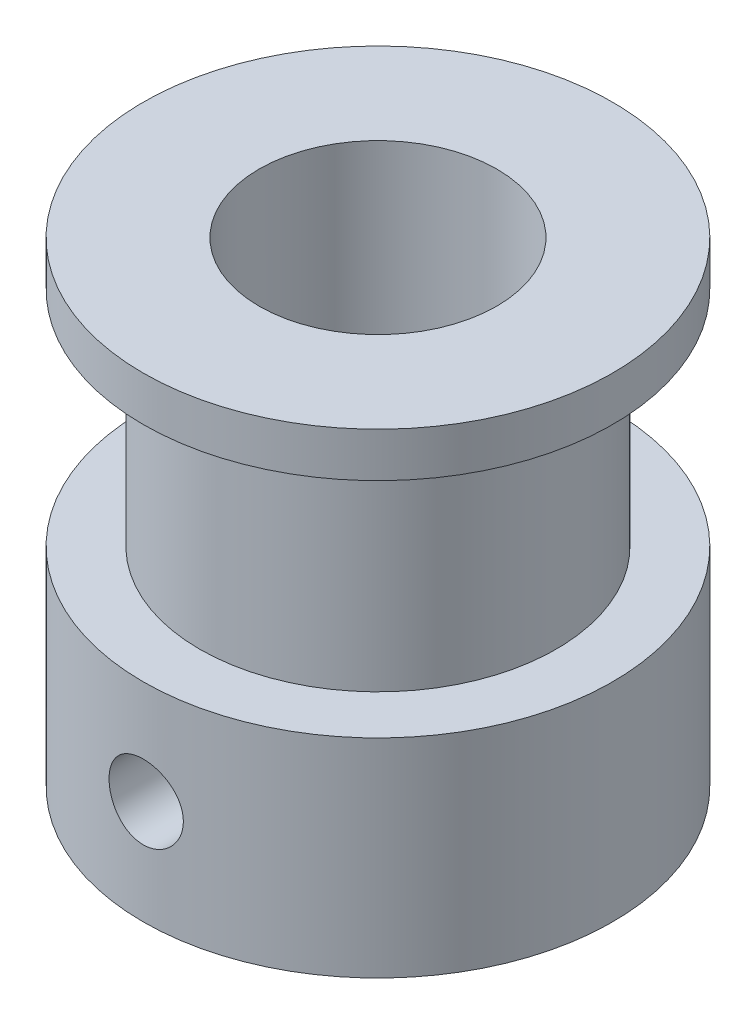
ISO-10303-21;
HEADER;
FILE_DESCRIPTION(('STEP AP214'),'2;1');
FILE_NAME('part.step','',(''),(''),'','','');
FILE_SCHEMA(('AUTOMOTIVE_DESIGN { 1 0 10303 214 1 1 1 1 }'));
ENDSEC;
DATA;
#1=APPLICATION_CONTEXT('core data for automotive mechanical design processes');
#2=APPLICATION_PROTOCOL_DEFINITION('international standard','automotive_design',2000,#1);
#3=PRODUCT_CONTEXT('',#1,'mechanical');
#4=PRODUCT('Part','Part','',(#3));
#5=PRODUCT_RELATED_PRODUCT_CATEGORY('part','',(#4));
#6=PRODUCT_DEFINITION_FORMATION('','',#4);
#7=PRODUCT_DEFINITION_CONTEXT('part definition',#1,'design');
#8=PRODUCT_DEFINITION('design','',#6,#7);
#9=PRODUCT_DEFINITION_SHAPE('','',#8);
#10=(LENGTH_UNIT() NAMED_UNIT(*) SI_UNIT(.MILLI.,.METRE.));
#11=(NAMED_UNIT(*) PLANE_ANGLE_UNIT() SI_UNIT($,.RADIAN.));
#12=(NAMED_UNIT(*) SI_UNIT($,.STERADIAN.) SOLID_ANGLE_UNIT());
#13=UNCERTAINTY_MEASURE_WITH_UNIT(LENGTH_MEASURE(1.E-05),#10,'distance_accuracy_value','');
#14=(GEOMETRIC_REPRESENTATION_CONTEXT(3) GLOBAL_UNCERTAINTY_ASSIGNED_CONTEXT((#13)) GLOBAL_UNIT_ASSIGNED_CONTEXT((#10,
#11,#12)) REPRESENTATION_CONTEXT('',''));
#15=CARTESIAN_POINT('',(0.,0.,0.));
#16=DIRECTION('',(0.,0.,1.));
#17=DIRECTION('',(1.,0.,0.));
#18=AXIS2_PLACEMENT_3D('',#15,#16,#17);
#19=CARTESIAN_POINT('',(0.,7.,0.));
#20=DIRECTION('',(0.,1.,0.));
#21=DIRECTION('',(0.,0.,1.));
#22=AXIS2_PLACEMENT_3D('',#19,#20,#21);
#23=PLANE('',#22);
#24=CARTESIAN_POINT('',(0.,7.,0.));
#25=DIRECTION('',(0.,1.,0.));
#26=DIRECTION('',(0.,0.,1.));
#27=AXIS2_PLACEMENT_3D('',#24,#25,#26);
#28=CIRCLE('',#27,7.9);
#29=CARTESIAN_POINT('',(0.,7.,7.9));
#30=VERTEX_POINT('',#29);
#31=EDGE_CURVE('E10',#30,#30,#28,.T.);
#32=ORIENTED_EDGE('',*,*,#31,.T.);
#33=EDGE_LOOP('',(#32));
#34=FACE_BOUND('',#33,.T.);
#35=CARTESIAN_POINT('',(0.,7.,0.));
#36=DIRECTION('',(0.,1.,0.));
#37=DIRECTION('',(0.,0.,1.));
#38=AXIS2_PLACEMENT_3D('',#35,#36,#37);
#39=CIRCLE('',#38,6.);
#40=CARTESIAN_POINT('',(0.,7.,6.));
#41=VERTEX_POINT('',#40);
#42=EDGE_CURVE('E50',#41,#41,#39,.T.);
#43=ORIENTED_EDGE('',*,*,#42,.F.);
#44=EDGE_LOOP('',(#43));
#45=FACE_BOUND('',#44,.T.);
#46=ADVANCED_FACE('F37',(#34,#45),#23,.T.);
#47=CARTESIAN_POINT('',(0.,7.,0.));
#48=DIRECTION('',(0.,-1.,0.));
#49=DIRECTION('',(0.,0.,-1.));
#50=AXIS2_PLACEMENT_3D('',#47,#48,#49);
#51=CYLINDRICAL_SURFACE('',#50,7.9);
#52=CARTESIAN_POINT('',(-7.80048075441507,3.5,-1.25000000000002));
#53=CARTESIAN_POINT('',(-7.80048196824595,3.56973989369435,-1.2499971554144));
#54=CARTESIAN_POINT('',(-7.80142614299678,3.63951911859434,-1.2441438663569));
#55=CARTESIAN_POINT('',(-7.80509784280027,3.77712328660007,-1.22089348012126));
#56=CARTESIAN_POINT('',(-7.80782706165348,3.84494630961194,-1.20348541856626));
#57=CARTESIAN_POINT('',(-7.81475217314737,3.97662654012584,-1.15766219601753));
#58=CARTESIAN_POINT('',(-7.81894689182457,4.04048687393076,-1.12925584342594));
#59=CARTESIAN_POINT('',(-7.82832897283751,4.16252683448403,-1.06226372462263));
#60=CARTESIAN_POINT('',(-7.83351621052813,4.22070717316823,-1.02367923639796));
#61=CARTESIAN_POINT('',(-7.84435043322809,4.33026115875551,-0.937059791226481));
#62=CARTESIAN_POINT('',(-7.8500007485374,4.3815769506425,-0.888952067778454));
#63=CARTESIAN_POINT('',(-7.86109482278362,4.47544325623422,-0.784808951987898));
#64=CARTESIAN_POINT('',(-7.86653856992945,4.51799327019374,-0.728773107962817));
#65=CARTESIAN_POINT('',(-7.87664118832278,4.59333545678014,-0.609991674138364));
#66=CARTESIAN_POINT('',(-7.88129569359209,4.62607407287386,-0.547211710815299));
#67=CARTESIAN_POINT('',(-7.88925842010555,4.68052018089015,-0.416957853417419));
#68=CARTESIAN_POINT('',(-7.89256672034717,4.70222832011729,-0.349484235045921));
#69=CARTESIAN_POINT('',(-7.89744077862982,4.73382110452107,-0.212355197447317));
#70=CARTESIAN_POINT('',(-7.89902083208134,4.7438027982615,-0.142722653338478));
#71=CARTESIAN_POINT('',(-7.90030942091785,4.75196090112679,-0.00275434445831943));
#72=CARTESIAN_POINT('',(-7.9000180714936,4.75013803685945,0.0675813767641417));
#73=CARTESIAN_POINT('',(-7.89760805287005,4.73481492089926,0.206296659486527));
#74=CARTESIAN_POINT('',(-7.89550572499048,4.72141909441022,0.274688080623744));
#75=CARTESIAN_POINT('',(-7.88972817510324,4.68349447575245,0.408239968348175));
#76=CARTESIAN_POINT('',(-7.88605290897266,4.65896537127992,0.473400344243236));
#77=CARTESIAN_POINT('',(-7.87751446945285,4.59936509070445,0.598953893137652));
#78=CARTESIAN_POINT('',(-7.8726464088646,4.56425040271986,0.659326065147056));
#79=CARTESIAN_POINT('',(-7.86226411391598,4.48450755216037,0.773360516916419));
#80=CARTESIAN_POINT('',(-7.8567498323264,4.43987869404471,0.827022305653314));
#81=CARTESIAN_POINT('',(-7.84561804182544,4.34179383856508,0.926728975640687));
#82=CARTESIAN_POINT('',(-7.84000006356061,4.2882466206829,0.972684113373464));
#83=CARTESIAN_POINT('',(-7.82935266125175,4.17415373862539,1.054970982814));
#84=CARTESIAN_POINT('',(-7.82432324165107,4.11360802162155,1.09130264187163));
#85=CARTESIAN_POINT('',(-7.81542235319799,3.98713820926677,1.15332599969679));
#86=CARTESIAN_POINT('',(-7.81155197179442,3.9212091364028,1.17900771496368));
#87=CARTESIAN_POINT('',(-7.80542599713566,3.78589826197222,1.21890786472326));
#88=CARTESIAN_POINT('',(-7.80317027652348,3.71651673318118,1.23312720332645));
#89=CARTESIAN_POINT('',(-7.80055342025268,3.57707106033214,1.2495743052425));
#90=CARTESIAN_POINT('',(-7.80017213209158,3.50702232697584,1.25192962842538));
#91=CARTESIAN_POINT('',(-7.80129372470702,3.36753099628457,1.24492101414712));
#92=CARTESIAN_POINT('',(-7.80279654017174,3.29808837802286,1.23555748291615));
#93=CARTESIAN_POINT('',(-7.8074984470217,3.16218049351229,1.20548542053581));
#94=CARTESIAN_POINT('',(-7.8106879341429,3.09570065743572,1.1848411026165));
#95=CARTESIAN_POINT('',(-7.81839582296529,2.96714456287309,1.13286054319024));
#96=CARTESIAN_POINT('',(-7.82291429702996,2.90506854440391,1.10152371946027));
#97=CARTESIAN_POINT('',(-7.83281820666235,2.78651235102445,1.02874381816774));
#98=CARTESIAN_POINT('',(-7.83821056402779,2.73008321030197,0.987218566010951));
#99=CARTESIAN_POINT('',(-7.8492341030112,2.62494865031936,0.89535409407462));
#100=CARTESIAN_POINT('',(-7.85486529969335,2.57624371916512,0.845014317712947));
#101=CARTESIAN_POINT('',(-7.86579537514688,2.48747832620896,0.736386357410056));
#102=CARTESIAN_POINT('',(-7.87109066772745,2.44750265818156,0.678028469370918));
#103=CARTESIAN_POINT('',(-7.88069571541925,2.37792284126527,0.555351334895922));
#104=CARTESIAN_POINT('',(-7.88500549991257,2.34831838315337,0.491032266268086));
#105=CARTESIAN_POINT('',(-7.89213828392446,2.30045513752589,0.358517100726274));
#106=CARTESIAN_POINT('',(-7.89496722611189,2.28215094773671,0.290337736178623));
#107=CARTESIAN_POINT('',(-7.89884461298431,2.25726123466697,0.151824668392011));
#108=CARTESIAN_POINT('',(-7.89989318912381,2.25067484619309,0.0814911245987161));
#109=CARTESIAN_POINT('',(-7.90009012061203,2.24943063599729,-0.0585133206258544));
#110=CARTESIAN_POINT('',(-7.89925908766459,2.25464342553085,-0.128183077445365));
#111=CARTESIAN_POINT('',(-7.89583198456055,2.276571047191,-0.265641782490361));
#112=CARTESIAN_POINT('',(-7.89323592200005,2.29328582981682,-0.333430738808881));
#113=CARTESIAN_POINT('',(-7.88656923220966,2.33769523582247,-0.465161329564501));
#114=CARTESIAN_POINT('',(-7.8824999411383,2.3653799120965,-0.529106389177183));
#115=CARTESIAN_POINT('',(-7.87333242946441,2.43092916392552,-0.651463944021488));
#116=CARTESIAN_POINT('',(-7.86823416797577,2.46879414401445,-0.709876219272524));
#117=CARTESIAN_POINT('',(-7.85750831225246,2.55409264601748,-0.820164261646109));
#118=CARTESIAN_POINT('',(-7.85187577634953,2.60162133714928,-0.871965950188417));
#119=CARTESIAN_POINT('',(-7.84075160986975,2.70469797284922,-0.966904822970376));
#120=CARTESIAN_POINT('',(-7.83526001262356,2.76024779412815,-1.0100399738287));
#121=CARTESIAN_POINT('',(-7.82500223121565,2.87820395512678,-1.08666853535374));
#122=CARTESIAN_POINT('',(-7.82024084059847,2.94065132859915,-1.12009942077419));
#123=CARTESIAN_POINT('',(-7.81203896574264,3.07032292116694,-1.17594676367274));
#124=CARTESIAN_POINT('',(-7.80859713603734,3.13754219132961,-1.19837444693125));
#125=CARTESIAN_POINT('',(-7.80420400550469,3.2542037477451,-1.22659378104556));
#126=CARTESIAN_POINT('',(-7.80281536124629,3.30293207175659,-1.235357372328));
#127=CARTESIAN_POINT('',(-7.80095331229171,3.40110034367531,-1.2470614458588));
#128=CARTESIAN_POINT('',(-7.80047989356296,3.45054028066013,-1.25000201738776));
#129=CARTESIAN_POINT('',(-7.80048075441507,3.5,-1.25000000000002));
#130=B_SPLINE_CURVE_WITH_KNOTS('',3,(#52,#53,#54,#55,#56,#57,#58,#59,#60,#61,#62,#63,#64,#65,
#66,#67,#68,#69,#70,#71,#72,#73,#74,#75,#76,#77,#78,#79,#80,#81,#82,#83,#84,#85,#86,#87,#88,#89,
#90,#91,#92,#93,#94,#95,#96,#97,#98,#99,#100,#101,#102,#103,#104,#105,#106,#107,#108,#109,#110,
#111,#112,#113,#114,#115,#116,#117,#118,#119,#120,#121,#122,#123,#124,#125,#126,#127,#128,#129),
.UNSPECIFIED.,.T.,.F.,(4,2,2,2,2,2,2,2,2,2,2,2,2,2,2,2,2,2,2,2,2,2,2,2,2,2,2,2,2,2,2,2,2,2,2,2,
2,2,4),(0.,0.209038860384317,0.418276362819815,0.627346634880909,0.836390668146062,
1.0470983499491,1.257818041072,1.46966785111934,1.68150522768895,1.89157679457175,
2.10163543100929,2.30981823001117,2.51800686918851,2.72706321147041,2.93613484222225,
3.1474935290594,3.35885381145241,3.57041178234204,3.78195306467671,3.99121496217058,
4.20046960587159,4.40854534027447,4.61663240652268,4.82645639734605,5.03629364202444,
5.24808649717644,5.45987303707664,5.67080302580451,5.88171743969986,6.09033020379922,
6.29894207010408,6.5073652059523,6.71579662511903,6.92638984169549,7.1370324110297,
7.34900348133674,7.56075784065829,7.70901103324179,7.85726195273772),.UNSPECIFIED.);
#131=CARTESIAN_POINT('',(-7.80048075441507,3.5,-1.25000000000002));
#132=VERTEX_POINT('',#131);
#133=EDGE_CURVE('E94',#132,#132,#130,.T.);
#134=ORIENTED_EDGE('',*,*,#133,.T.);
#135=EDGE_LOOP('',(#134));
#136=FACE_BOUND('',#135,.T.);
#137=CARTESIAN_POINT('',(-1.24999999999999,3.5,7.80048075441508));
#138=CARTESIAN_POINT('',(-1.24999715541437,3.56973989369435,7.80048196824596));
#139=CARTESIAN_POINT('',(-1.24414386635687,3.63951911859434,7.80142614299679));
#140=CARTESIAN_POINT('',(-1.22089348012123,3.77712328660007,7.80509784280027));
#141=CARTESIAN_POINT('',(-1.20348541856623,3.84494630961194,7.80782706165348));
#142=CARTESIAN_POINT('',(-1.1576621960175,3.97662654012584,7.81475217314737));
#143=CARTESIAN_POINT('',(-1.12925584342591,4.04048687393076,7.81894689182457));
#144=CARTESIAN_POINT('',(-1.06226372462261,4.16252683448403,7.82832897283751));
#145=CARTESIAN_POINT('',(-1.02367923639794,4.22070717316823,7.83351621052813));
#146=CARTESIAN_POINT('',(-0.937059791226454,4.33026115875551,7.8443504332281));
#147=CARTESIAN_POINT('',(-0.888952067778427,4.3815769506425,7.85000074853741));
#148=CARTESIAN_POINT('',(-0.78480895198787,4.47544325623422,7.86109482278362));
#149=CARTESIAN_POINT('',(-0.72877310796279,4.51799327019374,7.86653856992945));
#150=CARTESIAN_POINT('',(-0.609991674138336,4.59333545678014,7.87664118832278));
#151=CARTESIAN_POINT('',(-0.547211710815271,4.62607407287386,7.88129569359209));
#152=CARTESIAN_POINT('',(-0.41695785341739,4.68052018089015,7.88925842010556));
#153=CARTESIAN_POINT('',(-0.349484235045892,4.70222832011729,7.89256672034717));
#154=CARTESIAN_POINT('',(-0.212355197447289,4.73382110452107,7.89744077862982));
#155=CARTESIAN_POINT('',(-0.14272265333845,4.7438027982615,7.89902083208134));
#156=CARTESIAN_POINT('',(-0.0027543444582917,4.75196090112678,7.90030942091785));
#157=CARTESIAN_POINT('',(0.0675813767641694,4.75013803685945,7.9000180714936));
#158=CARTESIAN_POINT('',(0.206296659486555,4.73481492089926,7.89760805287005));
#159=CARTESIAN_POINT('',(0.274688080623771,4.72141909441022,7.89550572499047));
#160=CARTESIAN_POINT('',(0.408239968348202,4.68349447575245,7.88972817510324));
#161=CARTESIAN_POINT('',(0.473400344243263,4.65896537127992,7.88605290897266));
#162=CARTESIAN_POINT('',(0.59895389313768,4.59936509070445,7.87751446945285));
#163=CARTESIAN_POINT('',(0.659326065147084,4.56425040271986,7.8726464088646));
#164=CARTESIAN_POINT('',(0.773360516916446,4.48450755216037,7.86226411391598));
#165=CARTESIAN_POINT('',(0.827022305653342,4.43987869404471,7.8567498323264));
#166=CARTESIAN_POINT('',(0.926728975640715,4.34179383856508,7.84561804182544));
#167=CARTESIAN_POINT('',(0.972684113373492,4.2882466206829,7.84000006356061));
#168=CARTESIAN_POINT('',(1.05497098281403,4.17415373862539,7.82935266125175));
#169=CARTESIAN_POINT('',(1.09130264187165,4.11360802162155,7.82432324165106));
#170=CARTESIAN_POINT('',(1.15332599969682,3.98713820926677,7.81542235319799));
#171=CARTESIAN_POINT('',(1.17900771496371,3.9212091364028,7.81155197179442));
#172=CARTESIAN_POINT('',(1.21890786472329,3.78589826197222,7.80542599713565));
#173=CARTESIAN_POINT('',(1.23312720332647,3.71651673318118,7.80317027652348));
#174=CARTESIAN_POINT('',(1.24957430524253,3.57707106033214,7.80055342025268));
#175=CARTESIAN_POINT('',(1.25192962842541,3.50702232697584,7.80017213209158));
#176=CARTESIAN_POINT('',(1.24492101414714,3.36753099628457,7.80129372470701));
#177=CARTESIAN_POINT('',(1.23555748291618,3.29808837802285,7.80279654017173));
#178=CARTESIAN_POINT('',(1.20548542053584,3.16218049351229,7.8074984470217));
#179=CARTESIAN_POINT('',(1.18484110261653,3.09570065743572,7.81068793414289));
#180=CARTESIAN_POINT('',(1.13286054319027,2.96714456287309,7.81839582296528));
#181=CARTESIAN_POINT('',(1.1015237194603,2.90506854440391,7.82291429702996));
#182=CARTESIAN_POINT('',(1.02874381816777,2.78651235102445,7.83281820666234));
#183=CARTESIAN_POINT('',(0.987218566010977,2.73008321030197,7.83821056402778));
#184=CARTESIAN_POINT('',(0.895354094074646,2.62494865031936,7.8492341030112));
#185=CARTESIAN_POINT('',(0.845014317712973,2.57624371916512,7.85486529969335));
#186=CARTESIAN_POINT('',(0.736386357410082,2.48747832620896,7.86579537514688));
#187=CARTESIAN_POINT('',(0.678028469370945,2.44750265818156,7.87109066772745));
#188=CARTESIAN_POINT('',(0.555351334895949,2.37792284126527,7.88069571541925));
#189=CARTESIAN_POINT('',(0.491032266268113,2.34831838315337,7.88500549991257));
#190=CARTESIAN_POINT('',(0.358517100726301,2.30045513752589,7.89213828392446));
#191=CARTESIAN_POINT('',(0.290337736178651,2.28215094773671,7.89496722611188));
#192=CARTESIAN_POINT('',(0.151824668392039,2.25726123466697,7.89884461298431));
#193=CARTESIAN_POINT('',(0.0814911245987436,2.25067484619309,7.89989318912381));
#194=CARTESIAN_POINT('',(-0.0585133206258273,2.24943063599729,7.90009012061203));
#195=CARTESIAN_POINT('',(-0.128183077445339,2.25464342553085,7.89925908766459));
#196=CARTESIAN_POINT('',(-0.265641782490335,2.276571047191,7.89583198456056));
#197=CARTESIAN_POINT('',(-0.333430738808854,2.29328582981682,7.89323592200005));
#198=CARTESIAN_POINT('',(-0.465161329564474,2.33769523582247,7.88656923220966));
#199=CARTESIAN_POINT('',(-0.529106389177155,2.36537991209651,7.8824999411383));
#200=CARTESIAN_POINT('',(-0.651463944021461,2.43092916392552,7.87333242946441));
#201=CARTESIAN_POINT('',(-0.709876219272497,2.46879414401445,7.86823416797577));
#202=CARTESIAN_POINT('',(-0.820164261646082,2.55409264601748,7.85750831225246));
#203=CARTESIAN_POINT('',(-0.87196595018839,2.60162133714928,7.85187577634953));
#204=CARTESIAN_POINT('',(-0.966904822970348,2.70469797284922,7.84075160986975));
#205=CARTESIAN_POINT('',(-1.01003997382868,2.76024779412815,7.83526001262356));
#206=CARTESIAN_POINT('',(-1.08666853535371,2.87820395512678,7.82500223121565));
#207=CARTESIAN_POINT('',(-1.12009942077417,2.94065132859915,7.82024084059847));
#208=CARTESIAN_POINT('',(-1.17594676367271,3.07032292116694,7.81203896574264));
#209=CARTESIAN_POINT('',(-1.19837444693122,3.13754219132962,7.80859713603735));
#210=CARTESIAN_POINT('',(-1.22659378104554,3.2542037477451,7.80420400550469));
#211=CARTESIAN_POINT('',(-1.23535737232797,3.30293207175659,7.80281536124629));
#212=CARTESIAN_POINT('',(-1.24706144585877,3.40110034367531,7.80095331229171));
#213=CARTESIAN_POINT('',(-1.25000201738773,3.45054028066013,7.80047989356297));
#214=CARTESIAN_POINT('',(-1.24999999999999,3.5,7.80048075441508));
#215=B_SPLINE_CURVE_WITH_KNOTS('',3,(#137,#138,#139,#140,#141,#142,#143,#144,#145,#146,#147,
#148,#149,#150,#151,#152,#153,#154,#155,#156,#157,#158,#159,#160,#161,#162,#163,#164,#165,#166,
#167,#168,#169,#170,#171,#172,#173,#174,#175,#176,#177,#178,#179,#180,#181,#182,#183,#184,#185,
#186,#187,#188,#189,#190,#191,#192,#193,#194,#195,#196,#197,#198,#199,#200,#201,#202,#203,#204,
#205,#206,#207,#208,#209,#210,#211,#212,#213,#214),.UNSPECIFIED.,.T.,.F.,(4,2,2,2,2,2,2,2,2,2,2,
2,2,2,2,2,2,2,2,2,2,2,2,2,2,2,2,2,2,2,2,2,2,2,2,2,2,2,4),(0.,0.209038860384317,
0.418276362819815,0.627346634880909,0.836390668146062,1.0470983499491,1.257818041072,
1.46966785111934,1.68150522768895,1.89157679457175,2.10163543100929,2.30981823001117,
2.51800686918851,2.72706321147041,2.93613484222225,3.1474935290594,3.35885381145241,
3.57041178234204,3.78195306467671,3.99121496217058,4.20046960587159,4.40854534027447,
4.61663240652268,4.82645639734605,5.03629364202444,5.24808649717644,5.45987303707664,
5.67080302580451,5.88171743969986,6.09033020379922,6.29894207010408,6.5073652059523,
6.71579662511903,6.92638984169549,7.1370324110297,7.34900348133674,7.56075784065829,
7.70901103324179,7.85726195273772),.UNSPECIFIED.);
#216=CARTESIAN_POINT('',(-1.24999999999999,3.5,7.80048075441508));
#217=VERTEX_POINT('',#216);
#218=EDGE_CURVE('E74',#217,#217,#215,.T.);
#219=ORIENTED_EDGE('',*,*,#218,.T.);
#220=EDGE_LOOP('',(#219));
#221=FACE_BOUND('',#220,.T.);
#222=ORIENTED_EDGE('',*,*,#31,.F.);
#223=EDGE_LOOP('',(#222));
#224=FACE_BOUND('',#223,.T.);
#225=CARTESIAN_POINT('',(0.,0.,0.));
#226=DIRECTION('',(0.,1.,0.));
#227=DIRECTION('',(0.,0.,1.));
#228=AXIS2_PLACEMENT_3D('',#225,#226,#227);
#229=CIRCLE('',#228,7.9);
#230=CARTESIAN_POINT('',(0.,0.,7.9));
#231=VERTEX_POINT('',#230);
#232=EDGE_CURVE('E41',#231,#231,#229,.T.);
#233=ORIENTED_EDGE('',*,*,#232,.T.);
#234=EDGE_LOOP('',(#233));
#235=FACE_BOUND('',#234,.T.);
#236=ADVANCED_FACE('F39',(#136,#221,#224,#235),#51,.T.);
#237=CARTESIAN_POINT('',(0.,0.,0.));
#238=DIRECTION('',(0.,1.,0.));
#239=DIRECTION('',(0.,0.,1.));
#240=AXIS2_PLACEMENT_3D('',#237,#238,#239);
#241=PLANE('',#240);
#242=CARTESIAN_POINT('',(0.,0.,0.));
#243=DIRECTION('',(0.,1.,0.));
#244=DIRECTION('',(0.,0.,1.));
#245=AXIS2_PLACEMENT_3D('',#242,#243,#244);
#246=CIRCLE('',#245,4.);
#247=CARTESIAN_POINT('',(0.,0.,4.));
#248=VERTEX_POINT('',#247);
#249=EDGE_CURVE('E59',#248,#248,#246,.T.);
#250=ORIENTED_EDGE('',*,*,#249,.T.);
#251=EDGE_LOOP('',(#250));
#252=FACE_BOUND('',#251,.T.);
#253=ORIENTED_EDGE('',*,*,#232,.F.);
#254=EDGE_LOOP('',(#253));
#255=FACE_BOUND('',#254,.T.);
#256=ADVANCED_FACE('F137',(#252,#255),#241,.F.);
#257=CARTESIAN_POINT('',(0.,14.5,0.));
#258=DIRECTION('',(0.,-1.,0.));
#259=DIRECTION('',(0.,0.,-1.));
#260=AXIS2_PLACEMENT_3D('',#257,#258,#259);
#261=CYLINDRICAL_SURFACE('',#260,6.);
#262=CARTESIAN_POINT('',(0.,14.5,0.));
#263=DIRECTION('',(0.,1.,0.));
#264=DIRECTION('',(0.,0.,1.));
#265=AXIS2_PLACEMENT_3D('',#262,#263,#264);
#266=CIRCLE('',#265,6.);
#267=CARTESIAN_POINT('',(0.,14.5,6.));
#268=VERTEX_POINT('',#267);
#269=EDGE_CURVE('E48',#268,#268,#266,.T.);
#270=ORIENTED_EDGE('',*,*,#269,.F.);
#271=EDGE_LOOP('',(#270));
#272=FACE_BOUND('',#271,.T.);
#273=ORIENTED_EDGE('',*,*,#42,.T.);
#274=EDGE_LOOP('',(#273));
#275=FACE_BOUND('',#274,.T.);
#276=ADVANCED_FACE('F131',(#272,#275),#261,.T.);
#277=CARTESIAN_POINT('',(0.,14.5,0.));
#278=DIRECTION('',(0.,1.,0.));
#279=DIRECTION('',(0.,0.,1.));
#280=AXIS2_PLACEMENT_3D('',#277,#278,#279);
#281=PLANE('',#280);
#282=CARTESIAN_POINT('',(0.,14.5,0.));
#283=DIRECTION('',(0.,1.,0.));
#284=DIRECTION('',(0.,0.,1.));
#285=AXIS2_PLACEMENT_3D('',#282,#283,#284);
#286=CIRCLE('',#285,7.9);
#287=CARTESIAN_POINT('',(0.,14.5,7.9));
#288=VERTEX_POINT('',#287);
#289=EDGE_CURVE('E56',#288,#288,#286,.T.);
#290=ORIENTED_EDGE('',*,*,#289,.F.);
#291=EDGE_LOOP('',(#290));
#292=FACE_BOUND('',#291,.T.);
#293=ORIENTED_EDGE('',*,*,#269,.T.);
#294=EDGE_LOOP('',(#293));
#295=FACE_BOUND('',#294,.T.);
#296=ADVANCED_FACE('F125',(#292,#295),#281,.F.);
#297=CARTESIAN_POINT('',(0.,16.,0.));
#298=DIRECTION('',(0.,-1.,0.));
#299=DIRECTION('',(0.,0.,-1.));
#300=AXIS2_PLACEMENT_3D('',#297,#298,#299);
#301=CYLINDRICAL_SURFACE('',#300,7.9);
#302=CARTESIAN_POINT('',(0.,16.,0.));
#303=DIRECTION('',(0.,1.,0.));
#304=DIRECTION('',(0.,0.,1.));
#305=AXIS2_PLACEMENT_3D('',#302,#303,#304);
#306=CIRCLE('',#305,7.9);
#307=CARTESIAN_POINT('',(0.,16.,7.9));
#308=VERTEX_POINT('',#307);
#309=EDGE_CURVE('E53',#308,#308,#306,.T.);
#310=ORIENTED_EDGE('',*,*,#309,.F.);
#311=EDGE_LOOP('',(#310));
#312=FACE_BOUND('',#311,.T.);
#313=ORIENTED_EDGE('',*,*,#289,.T.);
#314=EDGE_LOOP('',(#313));
#315=FACE_BOUND('',#314,.T.);
#316=ADVANCED_FACE('F120',(#312,#315),#301,.T.);
#317=CARTESIAN_POINT('',(0.,16.,0.));
#318=DIRECTION('',(0.,1.,0.));
#319=DIRECTION('',(0.,0.,1.));
#320=AXIS2_PLACEMENT_3D('',#317,#318,#319);
#321=PLANE('',#320);
#322=CARTESIAN_POINT('',(0.,16.,0.));
#323=DIRECTION('',(0.,1.,0.));
#324=DIRECTION('',(0.,0.,1.));
#325=AXIS2_PLACEMENT_3D('',#322,#323,#324);
#326=CIRCLE('',#325,4.);
#327=CARTESIAN_POINT('',(0.,16.,4.));
#328=VERTEX_POINT('',#327);
#329=EDGE_CURVE('E62',#328,#328,#326,.T.);
#330=ORIENTED_EDGE('',*,*,#329,.F.);
#331=EDGE_LOOP('',(#330));
#332=FACE_BOUND('',#331,.T.);
#333=ORIENTED_EDGE('',*,*,#309,.T.);
#334=EDGE_LOOP('',(#333));
#335=FACE_BOUND('',#334,.T.);
#336=ADVANCED_FACE('F113',(#332,#335),#321,.T.);
#337=CARTESIAN_POINT('',(0.,0.,0.));
#338=DIRECTION('',(0.,1.,0.));
#339=DIRECTION('',(0.,0.,1.));
#340=AXIS2_PLACEMENT_3D('',#337,#338,#339);
#341=CYLINDRICAL_SURFACE('',#340,4.);
#342=CARTESIAN_POINT('',(-3.79967103839266,3.5,-1.25000000000001));
#343=CARTESIAN_POINT('',(-3.79967145961936,3.43165296389066,-1.24999953780048));
#344=CARTESIAN_POINT('',(-3.80153531505042,3.3633012312968,-1.24437538791495));
#345=CARTESIAN_POINT('',(-3.80875638998877,3.2286058391222,-1.22209175401327));
#346=CARTESIAN_POINT('',(-3.81411455353136,3.16226272726784,-1.20542928782516));
#347=CARTESIAN_POINT('',(-3.8276593883596,3.033555098068,-1.1616978822356));
#348=CARTESIAN_POINT('',(-3.83584105194317,2.97118376689432,-1.13464735736678));
#349=CARTESIAN_POINT('',(-3.85410406218688,2.85184730413599,-1.07096914173158));
#350=CARTESIAN_POINT('',(-3.8641857443584,2.79488313003988,-1.03433975905633));
#351=CARTESIAN_POINT('',(-3.8855012766862,2.68602113250652,-0.9511960706223));
#352=CARTESIAN_POINT('',(-3.8967612338478,2.63433639056402,-0.904409399720406));
#353=CARTESIAN_POINT('',(-3.91894245860335,2.53940398679082,-0.802862046455502));
#354=CARTESIAN_POINT('',(-3.92986367872627,2.49615750305516,-0.748100252518573));
#355=CARTESIAN_POINT('',(-3.95043553390078,2.41838893698876,-0.630625912493371));
#356=CARTESIAN_POINT('',(-3.9600518456278,2.38408629616855,-0.567761556520104));
#357=CARTESIAN_POINT('',(-3.97662551833019,2.32662395014446,-0.436804232853414));
#358=CARTESIAN_POINT('',(-3.98358350419919,2.30346162585042,-0.368712498487063));
#359=CARTESIAN_POINT('',(-3.99387175820862,2.26964887190294,-0.23146435696611));
#360=CARTESIAN_POINT('',(-3.99730738984143,2.25863425021216,-0.162405715468227));
#361=CARTESIAN_POINT('',(-4.00053595876015,2.24827565356248,-0.0233408139845335));
#362=CARTESIAN_POINT('',(-4.00032972410065,2.24892902564118,0.0466652269730699));
#363=CARTESIAN_POINT('',(-3.99637116132537,2.26164829158595,0.18307448035472));
#364=CARTESIAN_POINT('',(-3.99274150972158,2.27331938351303,0.249518634314029));
#365=CARTESIAN_POINT('',(-3.98249482560855,2.30709499004301,0.379453063347755));
#366=CARTESIAN_POINT('',(-3.97587759827134,2.32920018508656,0.44294314548118));
#367=CARTESIAN_POINT('',(-3.96023459729533,2.38347018907489,0.566078103154765));
#368=CARTESIAN_POINT('',(-3.95118033616957,2.41575480856304,0.625666405622814));
#369=CARTESIAN_POINT('',(-3.93161722953562,2.48937109970457,0.738702511152012));
#370=CARTESIAN_POINT('',(-3.92110801644585,2.53070505913784,0.79214875620882));
#371=CARTESIAN_POINT('',(-3.89923670734647,2.6232736348013,0.893737698453863));
#372=CARTESIAN_POINT('',(-3.88785731989084,2.6748490688412,0.94156654909416));
#373=CARTESIAN_POINT('',(-3.86590615440413,2.78539510182447,1.02798974259536));
#374=CARTESIAN_POINT('',(-3.85533447159847,2.84436657057501,1.06658299775339));
#375=CARTESIAN_POINT('',(-3.83610846648974,2.96891746885985,1.13380465019764));
#376=CARTESIAN_POINT('',(-3.82747690354324,3.03456340904239,1.1623168070268));
#377=CARTESIAN_POINT('',(-3.81337545338914,3.17005949189535,1.20778345948511));
#378=CARTESIAN_POINT('',(-3.80790443033294,3.23990811421048,1.22474210765791));
#379=CARTESIAN_POINT('',(-3.80099563391873,3.37881995256584,1.24601485185707));
#380=CARTESIAN_POINT('',(-3.79940466389697,3.44780199623211,1.25080954353709));
#381=CARTESIAN_POINT('',(-3.80001077463985,3.58558974149816,1.24896744498305));
#382=CARTESIAN_POINT('',(-3.8022072700839,3.65439546870047,1.24233242111454));
#383=CARTESIAN_POINT('',(-3.80998957482875,3.78780829665165,1.21824873513141));
#384=CARTESIAN_POINT('',(-3.81547554101732,3.85247927407399,1.20111831160536));
#385=CARTESIAN_POINT('',(-3.82911287331661,3.97802179199604,1.15690373661026));
#386=CARTESIAN_POINT('',(-3.83726467412388,4.03889271092119,1.12981796171153));
#387=CARTESIAN_POINT('',(-3.85560539653157,4.15703910977175,1.06557510655873));
#388=CARTESIAN_POINT('',(-3.86584603489734,4.21416141559277,1.02815147488555));
#389=CARTESIAN_POINT('',(-3.88710348972829,4.32149034636191,0.944606408679792));
#390=CARTESIAN_POINT('',(-3.89812050735703,4.37169516892533,0.898482714690764));
#391=CARTESIAN_POINT('',(-3.9202418756268,4.46591036591281,0.796572947753586));
#392=CARTESIAN_POINT('',(-3.9313309228568,4.50957778613986,0.740465649788503));
#393=CARTESIAN_POINT('',(-3.95189059843679,4.58689104332125,0.621451545651381));
#394=CARTESIAN_POINT('',(-3.96136130090946,4.62053733931103,0.558545051108606));
#395=CARTESIAN_POINT('',(-3.97756311928512,4.67653056247168,0.428105523331815));
#396=CARTESIAN_POINT('',(-3.984313995612,4.69895928784368,0.36061018428374));
#397=CARTESIAN_POINT('',(-3.99440242648576,4.7320725385897,0.222557254056374));
#398=CARTESIAN_POINT('',(-3.99774104914277,4.74276073908349,0.152000628340342));
#399=CARTESIAN_POINT('',(-4.00055803404462,4.75179100174962,0.0129849366488855));
#400=CARTESIAN_POINT('',(-4.0001912940739,4.75062845017075,-0.055439191946535));
#401=CARTESIAN_POINT('',(-3.99600978081049,4.7371881889513,-0.19107322192326));
#402=CARTESIAN_POINT('',(-3.99219523232619,4.72491120400805,-0.25828320217958));
#403=CARTESIAN_POINT('',(-3.98159570844795,4.68990599077772,-0.388755118480803));
#404=CARTESIAN_POINT('',(-3.97484847960205,4.66731039215462,-0.452055918449492));
#405=CARTESIAN_POINT('',(-3.9590794558795,4.61242917279152,-0.573998425500101));
#406=CARTESIAN_POINT('',(-3.95005727091358,4.58014189002657,-0.632639331274492));
#407=CARTESIAN_POINT('',(-3.93029896883376,4.50552724165556,-0.745761694969698));
#408=CARTESIAN_POINT('',(-3.91951509750962,4.46289647753602,-0.80003460705312));
#409=CARTESIAN_POINT('',(-3.89758736547061,4.36934011055653,-0.900820791399327));
#410=CARTESIAN_POINT('',(-3.88644339784826,4.31841202586061,-0.947331733504168));
#411=CARTESIAN_POINT('',(-3.86461892577438,4.2076842801589,-1.03282865911253));
#412=CARTESIAN_POINT('',(-3.85396600863456,4.14764659688342,-1.07151427994712));
#413=CARTESIAN_POINT('',(-3.83480125279531,4.02160187973086,-1.13820470748522));
#414=CARTESIAN_POINT('',(-3.82628854861386,3.95559727354975,-1.16621383403546));
#415=CARTESIAN_POINT('',(-3.81306560440327,3.82527738268533,-1.20871180435793));
#416=CARTESIAN_POINT('',(-3.80809315043749,3.76129745254843,-1.22414939837874));
#417=CARTESIAN_POINT('',(-3.80139606482398,3.63154616790351,-1.244792458161));
#418=CARTESIAN_POINT('',(-3.79967063301598,3.5657752587985,-1.25000044480779));
#419=CARTESIAN_POINT('',(-3.79967103839266,3.5,-1.25000000000001));
#420=B_SPLINE_CURVE_WITH_KNOTS('',3,(#342,#343,#344,#345,#346,#347,#348,#349,#350,#351,#352,
#353,#354,#355,#356,#357,#358,#359,#360,#361,#362,#363,#364,#365,#366,#367,#368,#369,#370,#371,
#372,#373,#374,#375,#376,#377,#378,#379,#380,#381,#382,#383,#384,#385,#386,#387,#388,#389,#390,
#391,#392,#393,#394,#395,#396,#397,#398,#399,#400,#401,#402,#403,#404,#405,#406,#407,#408,#409,
#410,#411,#412,#413,#414,#415,#416,#417,#418,#419),.UNSPECIFIED.,.T.,.F.,(4,2,2,2,2,2,2,2,2,2,2,
2,2,2,2,2,2,2,2,2,2,2,2,2,2,2,2,2,2,2,2,2,2,2,2,2,2,2,4),(0.,0.20479813754849,0.409651627059734,
0.614143644118578,0.818671804924945,1.02957080550838,1.24049922941122,1.45619821963732,
1.67184647417921,1.88083722835533,2.08978046471773,2.29150982969749,2.49325235190092,
2.69746404608408,2.90172742713186,3.11450338937332,3.32730439853774,3.54248470934452,
3.75758763952751,3.96404933287933,4.17047912219087,4.37093972044361,4.57143302253207,
4.77767613309608,4.98397288011877,5.19881937811508,5.41365603317084,5.62690239290995,
5.84008198140582,6.04438802439522,6.24868074692303,6.45041846514756,6.65219079911648,
6.86080693105211,7.06948557772187,7.28507795501701,7.50058300803818,7.69772354371382,
7.89481549188775),.UNSPECIFIED.);
#421=CARTESIAN_POINT('',(-3.79967103839266,3.5,-1.25000000000001));
#422=VERTEX_POINT('',#421);
#423=EDGE_CURVE('E98',#422,#422,#420,.T.);
#424=ORIENTED_EDGE('',*,*,#423,.T.);
#425=EDGE_LOOP('',(#424));
#426=FACE_BOUND('',#425,.T.);
#427=CARTESIAN_POINT('',(0.,2.25000000000001,4.));
#428=CARTESIAN_POINT('',(0.0684391851745461,2.25000044658758,3.99999965877989));
#429=CARTESIAN_POINT('',(0.136883052502858,2.25563922694446,3.99822694984841));
#430=CARTESIAN_POINT('',(0.271769209588447,2.27798624153924,3.99132894088807));
#431=CARTESIAN_POINT('',(0.338211042725905,2.29469698136437,3.9862028819986));
#432=CARTESIAN_POINT('',(0.467128543650804,2.33856937119574,3.97315815697909));
#433=CARTESIAN_POINT('',(0.529610176985801,2.36571484465297,3.96524381499025));
#434=CARTESIAN_POINT('',(0.649134802346456,2.42961731767834,3.94743969161093));
#435=CARTESIAN_POINT('',(0.706176935444881,2.46637583178059,3.93754959899905));
#436=CARTESIAN_POINT('',(0.814965334952276,2.54965599201737,3.91650213740283));
#437=CARTESIAN_POINT('',(0.866520028156655,2.59642088506108,3.90531715926989));
#438=CARTESIAN_POINT('',(0.961197382036988,2.69786839241355,3.88310046374209));
#439=CARTESIAN_POINT('',(1.00431847289869,2.75255247749455,3.87206877523457));
#440=CARTESIAN_POINT('',(1.08194336483113,2.86994456380809,3.85111144698172));
#441=CARTESIAN_POINT('',(1.11620784150128,2.93281747752723,3.84121988301796));
#442=CARTESIAN_POINT('',(1.17359741076671,3.06379231498188,3.82407801799235));
#443=CARTESIAN_POINT('',(1.19672543771944,3.13189285579393,3.81682702128689));
#444=CARTESIAN_POINT('',(1.23048459930033,3.26922807745206,3.80607606984501));
#445=CARTESIAN_POINT('',(1.24147110007864,3.33836684363885,3.80246972929508));
#446=CARTESIAN_POINT('',(1.25174555036987,3.47759311891189,3.7991005514095));
#447=CARTESIAN_POINT('',(1.25103660995771,3.54768037082166,3.79933669227334));
#448=CARTESIAN_POINT('',(1.23821824732739,3.68387446026898,3.80353189075438));
#449=CARTESIAN_POINT('',(1.22656057869382,3.75002912586156,3.80734341745949));
#450=CARTESIAN_POINT('',(1.19290813355625,3.87939215653735,3.81802025652489));
#451=CARTESIAN_POINT('',(1.1709122584455,3.9426002077088,3.82488589343115));
#452=CARTESIAN_POINT('',(1.11688874681277,4.06535194443263,3.84101044014297));
#453=CARTESIAN_POINT('',(1.08471925662081,4.12482861069198,3.85030284660825));
#454=CARTESIAN_POINT('',(1.01136020737848,4.23768776787912,3.8702185658007));
#455=CARTESIAN_POINT('',(0.970168305215768,4.29106867025371,3.88084222394551));
#456=CARTESIAN_POINT('',(0.877716954182119,4.39277494341698,3.90281527800493));
#457=CARTESIAN_POINT('',(0.826084570592813,4.44075955777968,3.91417569605696));
#458=CARTESIAN_POINT('',(0.715364408095527,4.52747189357967,3.9359157075958));
#459=CARTESIAN_POINT('',(0.656276077349017,4.5661989292192,3.94629522838372));
#460=CARTESIAN_POINT('',(0.531664610465451,4.63352768860127,3.96501294890191));
#461=CARTESIAN_POINT('',(0.466094906919277,4.66204813546396,3.97333460648208));
#462=CARTESIAN_POINT('',(0.330767977782643,4.70755300085156,3.98687955828554));
#463=CARTESIAN_POINT('',(0.261012030724607,4.72454092223839,3.99210379325151));
#464=CARTESIAN_POINT('',(0.122185157290344,4.74591804257897,3.99871389395014));
#465=CARTESIAN_POINT('',(0.053191848788842,4.75076854359352,4.00024022895439));
#466=CARTESIAN_POINT('',(-0.0846303057325843,4.74903377336267,3.99969799730981));
#467=CARTESIAN_POINT('',(-0.153459174306505,4.74245017267739,3.99762995581125));
#468=CARTESIAN_POINT('',(-0.28721933297585,4.7184044073936,3.99022363769772));
#469=CARTESIAN_POINT('',(-0.352204978420945,4.70121673238748,3.98496793110725));
#470=CARTESIAN_POINT('',(-0.478351928861362,4.65678564763331,3.97180121379252));
#471=CARTESIAN_POINT('',(-0.539512760449012,4.62954099597509,3.96388987514204));
#472=CARTESIAN_POINT('',(-0.657932406672228,4.5650267834512,3.94598542759568));
#473=CARTESIAN_POINT('',(-0.715059739787951,4.52752901250278,3.9359462681821));
#474=CARTESIAN_POINT('',(-0.82236585096009,4.44384678988298,3.91493410002887));
#475=CARTESIAN_POINT('',(-0.872542738043331,4.39765998225688,3.90396083845862));
#476=CARTESIAN_POINT('',(-0.966587462919651,4.29574110994631,3.88176994885248));
#477=CARTESIAN_POINT('',(-1.01012652339773,4.23970333625474,3.87055986714446));
#478=CARTESIAN_POINT('',(-1.08721250244908,4.12087338362926,3.84961947087602));
#479=CARTESIAN_POINT('',(-1.12075957972523,4.05808131199557,3.839889132814));
#480=CARTESIAN_POINT('',(-1.1767008348114,3.92765482711414,3.82311782360754));
#481=CARTESIAN_POINT('',(-1.19913819558885,3.8600403504953,3.81606646468027));
#482=CARTESIAN_POINT('',(-1.23222894320963,3.7217275066762,3.80551170941212));
#483=CARTESIAN_POINT('',(-1.24288681414609,3.65103032362869,3.80200696302675));
#484=CARTESIAN_POINT('',(-1.2517940615754,3.51199591244576,3.79908292712495));
#485=CARTESIAN_POINT('',(-1.25058279621956,3.44369654618707,3.79948604683077));
#486=CARTESIAN_POINT('',(-1.23708818129473,3.30832541508082,3.80390090472383));
#487=CARTESIAN_POINT('',(-1.22480534822559,3.241253593116,3.80791247457319));
#488=CARTESIAN_POINT('',(-1.18987729913377,3.11120596039822,3.81896814158112));
#489=CARTESIAN_POINT('',(-1.16738642405943,3.04818455890399,3.82596698183475));
#490=CARTESIAN_POINT('',(-1.11280227335063,2.92675958646865,3.84219704261348));
#491=CARTESIAN_POINT('',(-1.08070704444254,2.86835695792232,3.85142871716522));
#492=CARTESIAN_POINT('',(-1.00635675013474,2.75535402955944,3.8715348703158));
#493=CARTESIAN_POINT('',(-0.963753335241267,2.70099187049956,3.88245948922441));
#494=CARTESIAN_POINT('',(-0.870208996404842,2.60001367188821,3.90448998821726));
#495=CARTESIAN_POINT('',(-0.819265842344397,2.553399711009,3.91559591606795));
#496=CARTESIAN_POINT('',(-0.708486662823327,2.46771746163702,3.93717271952329));
#497=CARTESIAN_POINT('',(-0.648414574487375,2.42894526355004,3.94761101730634));
#498=CARTESIAN_POINT('',(-0.522279138013649,2.36210108486057,3.96626769296917));
#499=CARTESIAN_POINT('',(-0.456218157795445,2.33402489785818,3.97448694315832));
#500=CARTESIAN_POINT('',(-0.325747635373975,2.29140863239154,3.98720650733461));
#501=CARTESIAN_POINT('',(-0.261670337112544,2.27592513269467,3.99196240806139));
#502=CARTESIAN_POINT('',(-0.131729895440247,2.25522164003229,3.99835900340486));
#503=CARTESIAN_POINT('',(-0.0658671161396742,2.24999957019601,4.00000032839644));
#504=CARTESIAN_POINT('',(0.,2.25000000000001,4.));
#505=B_SPLINE_CURVE_WITH_KNOTS('',3,(#427,#428,#429,#430,#431,#432,#433,#434,#435,#436,#437,
#438,#439,#440,#441,#442,#443,#444,#445,#446,#447,#448,#449,#450,#451,#452,#453,#454,#455,#456,
#457,#458,#459,#460,#461,#462,#463,#464,#465,#466,#467,#468,#469,#470,#471,#472,#473,#474,#475,
#476,#477,#478,#479,#480,#481,#482,#483,#484,#485,#486,#487,#488,#489,#490,#491,#492,#493,#494,
#495,#496,#497,#498,#499,#500,#501,#502,#503,#504),.UNSPECIFIED.,.T.,.F.,(4,2,2,2,2,2,2,2,2,2,2,
2,2,2,2,2,2,2,2,2,2,2,2,2,2,2,2,2,2,2,2,2,2,2,2,2,2,2,4),(0.,0.205075449432509,
0.410197323349064,0.615002479202433,0.819839921558387,1.03037822195158,1.24095567431275,
1.45673771247493,1.67246286279526,1.88169150167209,2.09086450295137,2.29176917422168,
2.49269519979061,2.69655642720544,2.90047066010357,3.11366747279598,3.32688007413301,
3.54175460689768,3.75656384494552,3.96307568548235,4.1695573564936,4.37090626722869,
4.57228005034497,4.7785632473834,4.98490245709256,5.19941778713137,5.41392970983709,
5.62760115751028,5.84119123892427,6.0451220347605,6.24904331751081,6.44997913396668,
6.6509558433017,6.85979514006358,7.06869037373337,7.28440668126408,7.50003806666333,
7.69744636651537,7.89481470763043),.UNSPECIFIED.);
#506=CARTESIAN_POINT('',(0.,2.25000000000001,4.));
#507=VERTEX_POINT('',#506);
#508=EDGE_CURVE('E65',#507,#507,#505,.T.);
#509=ORIENTED_EDGE('',*,*,#508,.T.);
#510=EDGE_LOOP('',(#509));
#511=FACE_BOUND('',#510,.T.);
#512=ORIENTED_EDGE('',*,*,#249,.F.);
#513=EDGE_LOOP('',(#512));
#514=FACE_BOUND('',#513,.T.);
#515=ORIENTED_EDGE('',*,*,#329,.T.);
#516=EDGE_LOOP('',(#515));
#517=FACE_BOUND('',#516,.T.);
#518=ADVANCED_FACE('F79',(#426,#511,#514,#517),#341,.F.);
#519=CARTESIAN_POINT('',(0.,3.5,0.));
#520=DIRECTION('',(0.,0.,-1.));
#521=DIRECTION('',(-1.,0.,0.));
#522=AXIS2_PLACEMENT_3D('',#519,#520,#521);
#523=CYLINDRICAL_SURFACE('',#522,1.24999999999999);
#524=ORIENTED_EDGE('',*,*,#218,.F.);
#525=EDGE_LOOP('',(#524));
#526=FACE_BOUND('',#525,.T.);
#527=ORIENTED_EDGE('',*,*,#508,.F.);
#528=EDGE_LOOP('',(#527));
#529=FACE_BOUND('',#528,.T.);
#530=ADVANCED_FACE('F82',(#526,#529),#523,.F.);
#531=CARTESIAN_POINT('',(0.,3.5,0.));
#532=DIRECTION('',(1.,0.,0.));
#533=DIRECTION('',(0.,0.,-1.));
#534=AXIS2_PLACEMENT_3D('',#531,#532,#533);
#535=CYLINDRICAL_SURFACE('',#534,1.24999999999999);
#536=ORIENTED_EDGE('',*,*,#133,.F.);
#537=EDGE_LOOP('',(#536));
#538=FACE_BOUND('',#537,.T.);
#539=ORIENTED_EDGE('',*,*,#423,.F.);
#540=EDGE_LOOP('',(#539));
#541=FACE_BOUND('',#540,.T.);
#542=ADVANCED_FACE('F86',(#538,#541),#535,.F.);
#543=CLOSED_SHELL('',(#46,#236,#256,#276,#296,#316,#336,#518,#530,#542));
#544=MANIFOLD_SOLID_BREP('B2',#543);
#545=ADVANCED_BREP_SHAPE_REPRESENTATION('',(#18,#544),#14);
#546=SHAPE_DEFINITION_REPRESENTATION(#9,#545);
ENDSEC;
END-ISO-10303-21;
